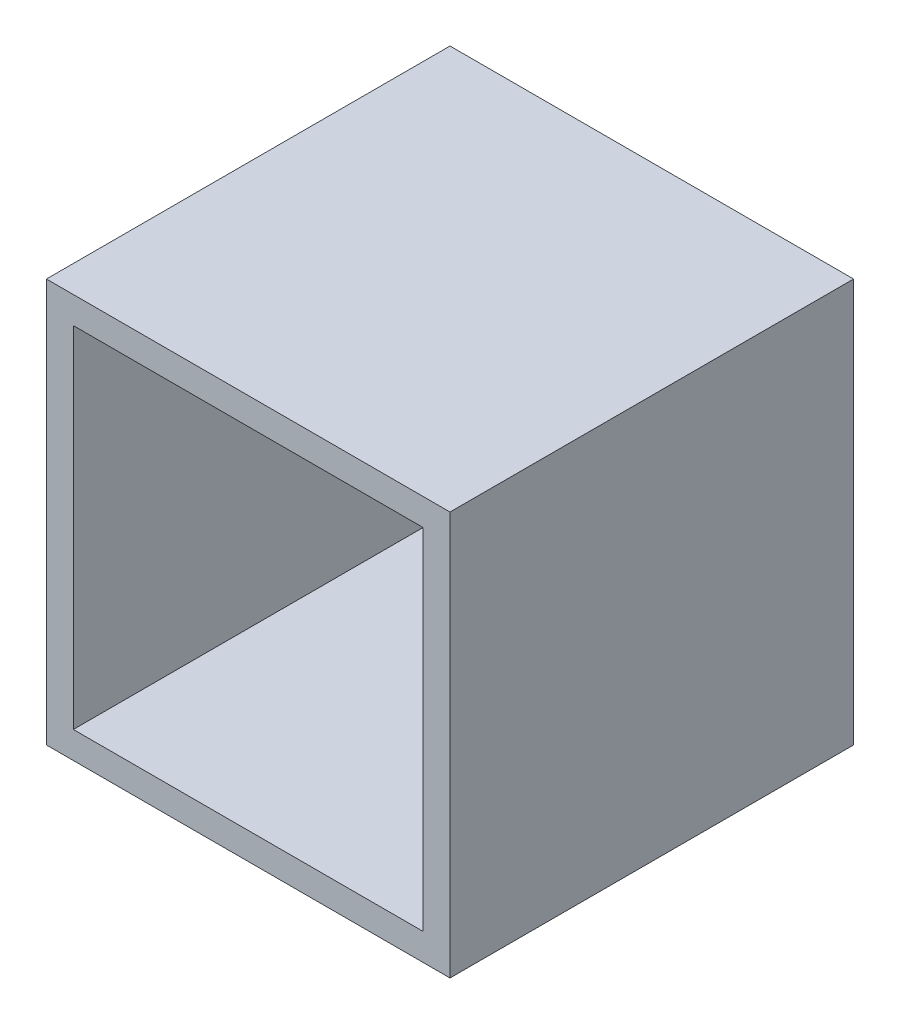
ISO-10303-21;
HEADER;
FILE_DESCRIPTION(('STEP AP214'),'2;1');
FILE_NAME('part.step','',(''),(''),'','','');
FILE_SCHEMA(('AUTOMOTIVE_DESIGN { 1 0 10303 214 1 1 1 1 }'));
ENDSEC;
DATA;
#1=APPLICATION_CONTEXT('core data for automotive mechanical design processes');
#2=APPLICATION_PROTOCOL_DEFINITION('international standard','automotive_design',2000,#1);
#3=PRODUCT_CONTEXT('',#1,'mechanical');
#4=PRODUCT('Part','Part','',(#3));
#5=PRODUCT_RELATED_PRODUCT_CATEGORY('part','',(#4));
#6=PRODUCT_DEFINITION_FORMATION('','',#4);
#7=PRODUCT_DEFINITION_CONTEXT('part definition',#1,'design');
#8=PRODUCT_DEFINITION('design','',#6,#7);
#9=PRODUCT_DEFINITION_SHAPE('','',#8);
#10=(LENGTH_UNIT() NAMED_UNIT(*) SI_UNIT(.MILLI.,.METRE.));
#11=(NAMED_UNIT(*) PLANE_ANGLE_UNIT() SI_UNIT($,.RADIAN.));
#12=(NAMED_UNIT(*) SI_UNIT($,.STERADIAN.) SOLID_ANGLE_UNIT());
#13=UNCERTAINTY_MEASURE_WITH_UNIT(LENGTH_MEASURE(1.E-05),#10,'distance_accuracy_value','');
#14=(GEOMETRIC_REPRESENTATION_CONTEXT(3) GLOBAL_UNCERTAINTY_ASSIGNED_CONTEXT((#13)) GLOBAL_UNIT_ASSIGNED_CONTEXT((#10,
#11,#12)) REPRESENTATION_CONTEXT('',''));
#15=CARTESIAN_POINT('',(0.,0.,0.));
#16=DIRECTION('',(0.,0.,1.));
#17=DIRECTION('',(1.,0.,0.));
#18=AXIS2_PLACEMENT_3D('',#15,#16,#17);
#19=CARTESIAN_POINT('',(0.,0.,30.));
#20=DIRECTION('',(1.,0.,0.));
#21=DIRECTION('',(0.,0.,-1.));
#22=AXIS2_PLACEMENT_3D('',#19,#20,#21);
#23=PLANE('',#22);
#24=DIRECTION('',(0.,-1.,0.));
#25=VECTOR('',#24,1.);
#26=CARTESIAN_POINT('',(0.,0.,0.));
#27=LINE('',#26,#25);
#28=CARTESIAN_POINT('',(0.,30.,0.));
#29=VERTEX_POINT('',#28);
#30=CARTESIAN_POINT('',(0.,0.,0.));
#31=VERTEX_POINT('',#30);
#32=EDGE_CURVE('E147',#29,#31,#27,.T.);
#33=ORIENTED_EDGE('',*,*,#32,.T.);
#34=DIRECTION('',(0.,0.,-1.));
#35=VECTOR('',#34,1.);
#36=CARTESIAN_POINT('',(0.,0.,30.));
#37=LINE('',#36,#35);
#38=CARTESIAN_POINT('',(0.,0.,30.));
#39=VERTEX_POINT('',#38);
#40=EDGE_CURVE('E11',#39,#31,#37,.T.);
#41=ORIENTED_EDGE('',*,*,#40,.F.);
#42=DIRECTION('',(0.,-1.,0.));
#43=VECTOR('',#42,1.);
#44=CARTESIAN_POINT('',(0.,0.,30.));
#45=LINE('',#44,#43);
#46=CARTESIAN_POINT('',(0.,30.,30.));
#47=VERTEX_POINT('',#46);
#48=EDGE_CURVE('E153',#47,#39,#45,.T.);
#49=ORIENTED_EDGE('',*,*,#48,.F.);
#50=DIRECTION('',(0.,0.,-1.));
#51=VECTOR('',#50,1.);
#52=CARTESIAN_POINT('',(0.,30.,30.));
#53=LINE('',#52,#51);
#54=EDGE_CURVE('E167',#47,#29,#53,.T.);
#55=ORIENTED_EDGE('',*,*,#54,.T.);
#56=EDGE_LOOP('',(#33,#41,#49,#55));
#57=FACE_BOUND('',#56,.T.);
#58=ADVANCED_FACE('F39',(#57),#23,.F.);
#59=CARTESIAN_POINT('',(0.,0.,30.));
#60=DIRECTION('',(0.,1.,0.));
#61=DIRECTION('',(0.,0.,1.));
#62=AXIS2_PLACEMENT_3D('',#59,#60,#61);
#63=PLANE('',#62);
#64=DIRECTION('',(1.,0.,0.));
#65=VECTOR('',#64,1.);
#66=CARTESIAN_POINT('',(0.,0.,0.));
#67=LINE('',#66,#65);
#68=CARTESIAN_POINT('',(30.,0.,0.));
#69=VERTEX_POINT('',#68);
#70=EDGE_CURVE('E171',#31,#69,#67,.T.);
#71=ORIENTED_EDGE('',*,*,#70,.T.);
#72=DIRECTION('',(0.,0.,-1.));
#73=VECTOR('',#72,1.);
#74=CARTESIAN_POINT('',(30.,0.,30.));
#75=LINE('',#74,#73);
#76=CARTESIAN_POINT('',(30.,0.,30.));
#77=VERTEX_POINT('',#76);
#78=EDGE_CURVE('E47',#77,#69,#75,.T.);
#79=ORIENTED_EDGE('',*,*,#78,.F.);
#80=DIRECTION('',(1.,0.,0.));
#81=VECTOR('',#80,1.);
#82=CARTESIAN_POINT('',(0.,0.,30.));
#83=LINE('',#82,#81);
#84=EDGE_CURVE('E157',#39,#77,#83,.T.);
#85=ORIENTED_EDGE('',*,*,#84,.F.);
#86=ORIENTED_EDGE('',*,*,#40,.T.);
#87=EDGE_LOOP('',(#71,#79,#85,#86));
#88=FACE_BOUND('',#87,.T.);
#89=ADVANCED_FACE('F205',(#88),#63,.F.);
#90=CARTESIAN_POINT('',(30.,0.,30.));
#91=DIRECTION('',(-1.,0.,0.));
#92=DIRECTION('',(0.,0.,1.));
#93=AXIS2_PLACEMENT_3D('',#90,#91,#92);
#94=PLANE('',#93);
#95=DIRECTION('',(0.,1.,0.));
#96=VECTOR('',#95,1.);
#97=CARTESIAN_POINT('',(30.,0.,0.));
#98=LINE('',#97,#96);
#99=CARTESIAN_POINT('',(30.,30.,0.));
#100=VERTEX_POINT('',#99);
#101=EDGE_CURVE('E174',#69,#100,#98,.T.);
#102=ORIENTED_EDGE('',*,*,#101,.T.);
#103=DIRECTION('',(0.,0.,-1.));
#104=VECTOR('',#103,1.);
#105=CARTESIAN_POINT('',(30.,30.,30.));
#106=LINE('',#105,#104);
#107=CARTESIAN_POINT('',(30.,30.,30.));
#108=VERTEX_POINT('',#107);
#109=EDGE_CURVE('E182',#108,#100,#106,.T.);
#110=ORIENTED_EDGE('',*,*,#109,.F.);
#111=DIRECTION('',(0.,1.,0.));
#112=VECTOR('',#111,1.);
#113=CARTESIAN_POINT('',(30.,0.,30.));
#114=LINE('',#113,#112);
#115=EDGE_CURVE('E161',#77,#108,#114,.T.);
#116=ORIENTED_EDGE('',*,*,#115,.F.);
#117=ORIENTED_EDGE('',*,*,#78,.T.);
#118=EDGE_LOOP('',(#102,#110,#116,#117));
#119=FACE_BOUND('',#118,.T.);
#120=ADVANCED_FACE('F191',(#119),#94,.F.);
#121=CARTESIAN_POINT('',(0.,30.,30.));
#122=DIRECTION('',(0.,-1.,0.));
#123=DIRECTION('',(0.,0.,-1.));
#124=AXIS2_PLACEMENT_3D('',#121,#122,#123);
#125=PLANE('',#124);
#126=DIRECTION('',(-1.,0.,0.));
#127=VECTOR('',#126,1.);
#128=CARTESIAN_POINT('',(0.,30.,0.));
#129=LINE('',#128,#127);
#130=EDGE_CURVE('E158',#100,#29,#129,.T.);
#131=ORIENTED_EDGE('',*,*,#130,.T.);
#132=ORIENTED_EDGE('',*,*,#54,.F.);
#133=DIRECTION('',(-1.,0.,0.));
#134=VECTOR('',#133,1.);
#135=CARTESIAN_POINT('',(0.,30.,30.));
#136=LINE('',#135,#134);
#137=EDGE_CURVE('E164',#108,#47,#136,.T.);
#138=ORIENTED_EDGE('',*,*,#137,.F.);
#139=ORIENTED_EDGE('',*,*,#109,.T.);
#140=EDGE_LOOP('',(#131,#132,#138,#139));
#141=FACE_BOUND('',#140,.T.);
#142=ADVANCED_FACE('F198',(#141),#125,.F.);
#143=CARTESIAN_POINT('',(0.,0.,30.));
#144=DIRECTION('',(0.,0.,-1.));
#145=DIRECTION('',(-1.,0.,0.));
#146=AXIS2_PLACEMENT_3D('',#143,#144,#145);
#147=PLANE('',#146);
#148=DIRECTION('',(1.,0.,0.));
#149=VECTOR('',#148,1.);
#150=CARTESIAN_POINT('',(2.,2.,30.));
#151=LINE('',#150,#149);
#152=CARTESIAN_POINT('',(2.,2.,30.));
#153=VERTEX_POINT('',#152);
#154=CARTESIAN_POINT('',(28.,2.,30.));
#155=VERTEX_POINT('',#154);
#156=EDGE_CURVE('E138',#153,#155,#151,.T.);
#157=ORIENTED_EDGE('',*,*,#156,.F.);
#158=DIRECTION('',(0.,-1.,0.));
#159=VECTOR('',#158,1.);
#160=CARTESIAN_POINT('',(2.,28.,30.));
#161=LINE('',#160,#159);
#162=CARTESIAN_POINT('',(2.,28.,30.));
#163=VERTEX_POINT('',#162);
#164=EDGE_CURVE('E54',#163,#153,#161,.T.);
#165=ORIENTED_EDGE('',*,*,#164,.F.);
#166=DIRECTION('',(-1.,0.,0.));
#167=VECTOR('',#166,1.);
#168=CARTESIAN_POINT('',(2.,28.,30.));
#169=LINE('',#168,#167);
#170=CARTESIAN_POINT('',(28.,28.,30.));
#171=VERTEX_POINT('',#170);
#172=EDGE_CURVE('E125',#171,#163,#169,.T.);
#173=ORIENTED_EDGE('',*,*,#172,.F.);
#174=DIRECTION('',(0.,1.,0.));
#175=VECTOR('',#174,1.);
#176=CARTESIAN_POINT('',(28.,28.,30.));
#177=LINE('',#176,#175);
#178=EDGE_CURVE('E129',#155,#171,#177,.T.);
#179=ORIENTED_EDGE('',*,*,#178,.F.);
#180=EDGE_LOOP('',(#157,#165,#173,#179));
#181=FACE_BOUND('',#180,.T.);
#182=ORIENTED_EDGE('',*,*,#48,.T.);
#183=ORIENTED_EDGE('',*,*,#84,.T.);
#184=ORIENTED_EDGE('',*,*,#115,.T.);
#185=ORIENTED_EDGE('',*,*,#137,.T.);
#186=EDGE_LOOP('',(#182,#183,#184,#185));
#187=FACE_BOUND('',#186,.T.);
#188=ADVANCED_FACE('F204',(#181,#187),#147,.F.);
#189=CARTESIAN_POINT('',(0.,0.,0.));
#190=DIRECTION('',(0.,0.,-1.));
#191=DIRECTION('',(-1.,0.,0.));
#192=AXIS2_PLACEMENT_3D('',#189,#190,#191);
#193=PLANE('',#192);
#194=DIRECTION('',(0.,-1.,0.));
#195=VECTOR('',#194,1.);
#196=CARTESIAN_POINT('',(2.,28.,0.));
#197=LINE('',#196,#195);
#198=CARTESIAN_POINT('',(2.,28.,0.));
#199=VERTEX_POINT('',#198);
#200=CARTESIAN_POINT('',(2.,2.,0.));
#201=VERTEX_POINT('',#200);
#202=EDGE_CURVE('E106',#199,#201,#197,.T.);
#203=ORIENTED_EDGE('',*,*,#202,.T.);
#204=DIRECTION('',(1.,0.,0.));
#205=VECTOR('',#204,1.);
#206=CARTESIAN_POINT('',(2.,2.,0.));
#207=LINE('',#206,#205);
#208=CARTESIAN_POINT('',(28.,2.,0.));
#209=VERTEX_POINT('',#208);
#210=EDGE_CURVE('E116',#201,#209,#207,.T.);
#211=ORIENTED_EDGE('',*,*,#210,.T.);
#212=DIRECTION('',(0.,1.,0.));
#213=VECTOR('',#212,1.);
#214=CARTESIAN_POINT('',(28.,28.,0.));
#215=LINE('',#214,#213);
#216=CARTESIAN_POINT('',(28.,28.,0.));
#217=VERTEX_POINT('',#216);
#218=EDGE_CURVE('E62',#209,#217,#215,.T.);
#219=ORIENTED_EDGE('',*,*,#218,.T.);
#220=DIRECTION('',(-1.,0.,0.));
#221=VECTOR('',#220,1.);
#222=CARTESIAN_POINT('',(2.,28.,0.));
#223=LINE('',#222,#221);
#224=EDGE_CURVE('E113',#217,#199,#223,.T.);
#225=ORIENTED_EDGE('',*,*,#224,.T.);
#226=EDGE_LOOP('',(#203,#211,#219,#225));
#227=FACE_BOUND('',#226,.T.);
#228=ORIENTED_EDGE('',*,*,#32,.F.);
#229=ORIENTED_EDGE('',*,*,#130,.F.);
#230=ORIENTED_EDGE('',*,*,#101,.F.);
#231=ORIENTED_EDGE('',*,*,#70,.F.);
#232=EDGE_LOOP('',(#228,#229,#230,#231));
#233=FACE_BOUND('',#232,.T.);
#234=ADVANCED_FACE('F121',(#227,#233),#193,.T.);
#235=CARTESIAN_POINT('',(2.,28.,0.));
#236=DIRECTION('',(-1.,0.,0.));
#237=DIRECTION('',(0.,-1.,0.));
#238=AXIS2_PLACEMENT_3D('',#235,#236,#237);
#239=PLANE('',#238);
#240=ORIENTED_EDGE('',*,*,#164,.T.);
#241=DIRECTION('',(0.,0.,1.));
#242=VECTOR('',#241,1.);
#243=CARTESIAN_POINT('',(2.,2.,0.));
#244=LINE('',#243,#242);
#245=EDGE_CURVE('E102',#201,#153,#244,.T.);
#246=ORIENTED_EDGE('',*,*,#245,.F.);
#247=ORIENTED_EDGE('',*,*,#202,.F.);
#248=DIRECTION('',(0.,0.,1.));
#249=VECTOR('',#248,1.);
#250=CARTESIAN_POINT('',(2.,28.,0.));
#251=LINE('',#250,#249);
#252=EDGE_CURVE('E144',#199,#163,#251,.T.);
#253=ORIENTED_EDGE('',*,*,#252,.T.);
#254=EDGE_LOOP('',(#240,#246,#247,#253));
#255=FACE_BOUND('',#254,.T.);
#256=ADVANCED_FACE('F104',(#255),#239,.F.);
#257=CARTESIAN_POINT('',(2.,28.,0.));
#258=DIRECTION('',(0.,1.,0.));
#259=DIRECTION('',(0.,0.,1.));
#260=AXIS2_PLACEMENT_3D('',#257,#258,#259);
#261=PLANE('',#260);
#262=ORIENTED_EDGE('',*,*,#172,.T.);
#263=ORIENTED_EDGE('',*,*,#252,.F.);
#264=ORIENTED_EDGE('',*,*,#224,.F.);
#265=DIRECTION('',(0.,0.,1.));
#266=VECTOR('',#265,1.);
#267=CARTESIAN_POINT('',(28.,28.,0.));
#268=LINE('',#267,#266);
#269=EDGE_CURVE('E148',#217,#171,#268,.T.);
#270=ORIENTED_EDGE('',*,*,#269,.T.);
#271=EDGE_LOOP('',(#262,#263,#264,#270));
#272=FACE_BOUND('',#271,.T.);
#273=ADVANCED_FACE('F222',(#272),#261,.F.);
#274=CARTESIAN_POINT('',(28.,28.,0.));
#275=DIRECTION('',(1.,0.,0.));
#276=DIRECTION('',(0.,1.,0.));
#277=AXIS2_PLACEMENT_3D('',#274,#275,#276);
#278=PLANE('',#277);
#279=ORIENTED_EDGE('',*,*,#178,.T.);
#280=ORIENTED_EDGE('',*,*,#269,.F.);
#281=ORIENTED_EDGE('',*,*,#218,.F.);
#282=DIRECTION('',(0.,0.,1.));
#283=VECTOR('',#282,1.);
#284=CARTESIAN_POINT('',(28.,2.,0.));
#285=LINE('',#284,#283);
#286=EDGE_CURVE('E112',#209,#155,#285,.T.);
#287=ORIENTED_EDGE('',*,*,#286,.T.);
#288=EDGE_LOOP('',(#279,#280,#281,#287));
#289=FACE_BOUND('',#288,.T.);
#290=ADVANCED_FACE('F225',(#289),#278,.F.);
#291=CARTESIAN_POINT('',(2.,2.,0.));
#292=DIRECTION('',(0.,-1.,0.));
#293=DIRECTION('',(0.,0.,-1.));
#294=AXIS2_PLACEMENT_3D('',#291,#292,#293);
#295=PLANE('',#294);
#296=ORIENTED_EDGE('',*,*,#156,.T.);
#297=ORIENTED_EDGE('',*,*,#286,.F.);
#298=ORIENTED_EDGE('',*,*,#210,.F.);
#299=ORIENTED_EDGE('',*,*,#245,.T.);
#300=EDGE_LOOP('',(#296,#297,#298,#299));
#301=FACE_BOUND('',#300,.T.);
#302=ADVANCED_FACE('F117',(#301),#295,.F.);
#303=CLOSED_SHELL('',(#58,#89,#120,#142,#188,#234,#256,#273,#290,#302));
#304=MANIFOLD_SOLID_BREP('B2',#303);
#305=ADVANCED_BREP_SHAPE_REPRESENTATION('',(#18,#304),#14);
#306=SHAPE_DEFINITION_REPRESENTATION(#9,#305);
ENDSEC;
END-ISO-10303-21;
